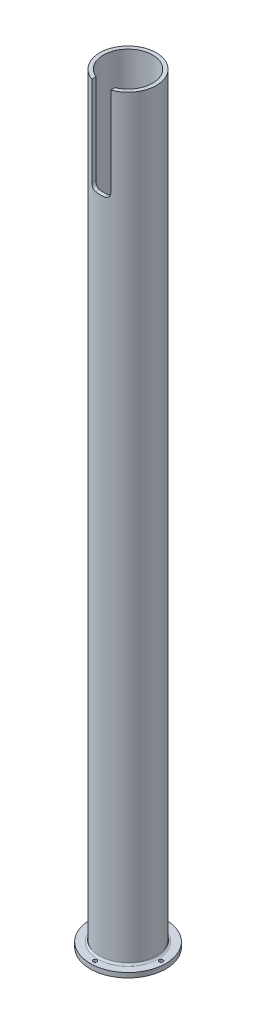
ISO-10303-21;
HEADER;
FILE_DESCRIPTION(('STEP AP214'),'2;1');
FILE_NAME('part.step','',(''),(''),'','','');
FILE_SCHEMA(('AUTOMOTIVE_DESIGN { 1 0 10303 214 1 1 1 1 }'));
ENDSEC;
DATA;
#1=APPLICATION_CONTEXT('core data for automotive mechanical design processes');
#2=APPLICATION_PROTOCOL_DEFINITION('international standard','automotive_design',2000,#1);
#3=PRODUCT_CONTEXT('',#1,'mechanical');
#4=PRODUCT('Part','Part','',(#3));
#5=PRODUCT_RELATED_PRODUCT_CATEGORY('part','',(#4));
#6=PRODUCT_DEFINITION_FORMATION('','',#4);
#7=PRODUCT_DEFINITION_CONTEXT('part definition',#1,'design');
#8=PRODUCT_DEFINITION('design','',#6,#7);
#9=PRODUCT_DEFINITION_SHAPE('','',#8);
#10=(LENGTH_UNIT() NAMED_UNIT(*) SI_UNIT(.MILLI.,.METRE.));
#11=(NAMED_UNIT(*) PLANE_ANGLE_UNIT() SI_UNIT($,.RADIAN.));
#12=(NAMED_UNIT(*) SI_UNIT($,.STERADIAN.) SOLID_ANGLE_UNIT());
#13=UNCERTAINTY_MEASURE_WITH_UNIT(LENGTH_MEASURE(1.E-05),#10,'distance_accuracy_value','');
#14=(GEOMETRIC_REPRESENTATION_CONTEXT(3) GLOBAL_UNCERTAINTY_ASSIGNED_CONTEXT((#13)) GLOBAL_UNIT_ASSIGNED_CONTEXT((#10,
#11,#12)) REPRESENTATION_CONTEXT('',''));
#15=CARTESIAN_POINT('',(0.,0.,0.));
#16=DIRECTION('',(0.,0.,1.));
#17=DIRECTION('',(1.,0.,0.));
#18=AXIS2_PLACEMENT_3D('',#15,#16,#17);
#19=CARTESIAN_POINT('',(0.,800.,0.));
#20=DIRECTION('',(0.,1.,0.));
#21=DIRECTION('',(0.,0.,1.));
#22=AXIS2_PLACEMENT_3D('',#19,#20,#21);
#23=PLANE('',#22);
#24=DIRECTION('',(0.,0.,-1.));
#25=VECTOR('',#24,1.);
#26=CARTESIAN_POINT('',(10.,800.,59.2422593859894));
#27=LINE('',#26,#25);
#28=CARTESIAN_POINT('',(10.,800.,28.2842712474619));
#29=VERTEX_POINT('',#28);
#30=CARTESIAN_POINT('',(10.,800.,24.));
#31=VERTEX_POINT('',#30);
#32=EDGE_CURVE('E93',#29,#31,#27,.T.);
#33=ORIENTED_EDGE('',*,*,#32,.F.);
#34=CARTESIAN_POINT('',(0.,800.,0.));
#35=DIRECTION('',(0.,1.,0.));
#36=DIRECTION('',(0.,0.,1.));
#37=AXIS2_PLACEMENT_3D('',#34,#35,#36);
#38=CIRCLE('',#37,30.);
#39=CARTESIAN_POINT('',(-10.,800.,28.2842712474619));
#40=VERTEX_POINT('',#39);
#41=EDGE_CURVE('E104',#29,#40,#38,.T.);
#42=ORIENTED_EDGE('',*,*,#41,.T.);
#43=DIRECTION('',(0.,0.,1.));
#44=VECTOR('',#43,1.);
#45=CARTESIAN_POINT('',(-10.,800.,59.2422593859894));
#46=LINE('',#45,#44);
#47=CARTESIAN_POINT('',(-10.,800.,24.));
#48=VERTEX_POINT('',#47);
#49=EDGE_CURVE('E107',#48,#40,#46,.T.);
#50=ORIENTED_EDGE('',*,*,#49,.F.);
#51=CARTESIAN_POINT('',(0.,800.,0.));
#52=DIRECTION('',(0.,1.,0.));
#53=DIRECTION('',(0.,0.,1.));
#54=AXIS2_PLACEMENT_3D('',#51,#52,#53);
#55=CIRCLE('',#54,26.);
#56=EDGE_CURVE('E106',#31,#48,#55,.T.);
#57=ORIENTED_EDGE('',*,*,#56,.F.);
#58=EDGE_LOOP('',(#33,#42,#50,#57));
#59=FACE_BOUND('',#58,.T.);
#60=ADVANCED_FACE('F36',(#59),#23,.T.);
#61=CARTESIAN_POINT('',(0.,800.,0.));
#62=DIRECTION('',(0.,-1.,0.));
#63=DIRECTION('',(0.,0.,-1.));
#64=AXIS2_PLACEMENT_3D('',#61,#62,#63);
#65=CYLINDRICAL_SURFACE('',#64,30.);
#66=ORIENTED_EDGE('',*,*,#41,.F.);
#67=DIRECTION('',(0.,-1.,0.));
#68=VECTOR('',#67,1.);
#69=CARTESIAN_POINT('',(10.,800.,28.2842712474619));
#70=LINE('',#69,#68);
#71=CARTESIAN_POINT('',(10.,705.,28.2842712474619));
#72=VERTEX_POINT('',#71);
#73=EDGE_CURVE('E90',#29,#72,#70,.T.);
#74=ORIENTED_EDGE('',*,*,#73,.T.);
#75=CARTESIAN_POINT('',(10.,705.,28.2842712474619));
#76=CARTESIAN_POINT('',(10.0000190729942,704.864337739915,28.2842568835754));
#77=CARTESIAN_POINT('',(9.99447954701745,704.728682456292,28.2862228024691));
#78=CARTESIAN_POINT('',(9.97242452302606,704.458407166221,28.294009981539));
#79=CARTESIAN_POINT('',(9.95591141628284,704.323786940685,28.2998304017733));
#80=CARTESIAN_POINT('',(9.91210971155053,704.056904848734,28.3152006115991));
#81=CARTESIAN_POINT('',(9.88485040485354,703.924637584562,28.3247402627795));
#82=CARTESIAN_POINT('',(9.8198196896855,703.663023642342,28.3473514268586));
#83=CARTESIAN_POINT('',(9.78204803970926,703.533677031466,28.3604230208981));
#84=CARTESIAN_POINT('',(9.69635010074509,703.27885238766,28.3898369422722));
#85=CARTESIAN_POINT('',(9.64842952739194,703.153372222611,28.4061774283579));
#86=CARTESIAN_POINT('',(9.54283633766438,702.907004468227,28.441824423037));
#87=CARTESIAN_POINT('',(9.48516009973037,702.786118604902,28.4611320328605));
#88=CARTESIAN_POINT('',(9.29815336408773,702.431505967402,28.5230014692243));
#89=CARTESIAN_POINT('',(9.15479335478684,702.205672157457,28.5695280039246));
#90=CARTESIAN_POINT('',(8.83013263364476,701.774275466147,28.6715626419015));
#91=CARTESIAN_POINT('',(8.64779954362491,701.56955093139,28.7273031988723));
#92=CARTESIAN_POINT('',(8.25291944408953,701.19304086922,28.8432248320726));
#93=CARTESIAN_POINT('',(8.04036219275768,701.02126655392,28.9034074101954));
#94=CARTESIAN_POINT('',(7.58000420509786,700.707600566116,29.0276228063441));
#95=CARTESIAN_POINT('',(7.33103250352341,700.567445619335,29.0917054388711));
#96=CARTESIAN_POINT('',(6.81247352936284,700.331380948338,29.2174811226627));
#97=CARTESIAN_POINT('',(6.54289755615135,700.235447173346,29.2791754560974));
#98=CARTESIAN_POINT('',(6.06074492852612,700.109175689502,29.3821685695545));
#99=CARTESIAN_POINT('',(5.85112670813669,700.068356546976,29.4246614762509));
#100=CARTESIAN_POINT('',(5.53366860939455,700.027416383081,29.4854225373401));
#101=CARTESIAN_POINT('',(5.42735465419152,700.01715109898,29.5051780558176));
#102=CARTESIAN_POINT('',(5.21406854364533,700.003441289199,29.543616278522));
#103=CARTESIAN_POINT('',(5.1070962346324,699.999998421625,29.5622987208798));
#104=CARTESIAN_POINT('',(5.00000000000003,700.,29.5803989154981));
#105=B_SPLINE_CURVE_WITH_KNOTS('',3,(#75,#76,#77,#78,#79,#80,#81,#82,#83,#84,#85,#86,#87,#88,
#89,#90,#91,#92,#93,#94,#95,#96,#97,#98,#99,#100,#101,#102,#103,#104),.UNSPECIFIED.,.F.,.F.,(4,
2,2,2,2,2,2,2,2,2,2,2,2,2,4),(0.,0.40684866099174,0.813608693968429,1.21926758890943,
1.62493580401968,2.0303761609891,2.43596735975757,3.24667110227931,4.08233899426423,
4.91829074009209,5.79267155602337,6.66657625564976,7.31802583416987,7.64368697008094,
7.96942724425668),.UNSPECIFIED.);
#106=CARTESIAN_POINT('',(5.,700.,29.5803989154981));
#107=VERTEX_POINT('',#106);
#108=EDGE_CURVE('E11',#72,#107,#105,.T.);
#109=ORIENTED_EDGE('',*,*,#108,.T.);
#110=CARTESIAN_POINT('',(0.,700.,0.));
#111=DIRECTION('',(0.,1.,0.));
#112=DIRECTION('',(0.,0.,1.));
#113=AXIS2_PLACEMENT_3D('',#110,#111,#112);
#114=CIRCLE('',#113,30.);
#115=CARTESIAN_POINT('',(-5.,700.,29.5803989154981));
#116=VERTEX_POINT('',#115);
#117=EDGE_CURVE('E198',#116,#107,#114,.T.);
#118=ORIENTED_EDGE('',*,*,#117,.F.);
#119=CARTESIAN_POINT('',(-5.,700.,29.5803989154981));
#120=CARTESIAN_POINT('',(-5.14356329835006,699.99998533013,29.5561430510399));
#121=CARTESIAN_POINT('',(-5.28693538648883,700.006182291599,29.5308233878388));
#122=CARTESIAN_POINT('',(-5.57225369279725,700.030796372334,29.4783116050369));
#123=CARTESIAN_POINT('',(-5.71420018171037,700.049211124933,29.4511198489871));
#124=CARTESIAN_POINT('',(-5.99548248658109,700.098023518038,29.3951487813498));
#125=CARTESIAN_POINT('',(-6.13482169036776,700.12840428602,29.3663717539848));
#126=CARTESIAN_POINT('',(-6.41014455563543,700.200859092261,29.3075050728138));
#127=CARTESIAN_POINT('',(-6.54612811649266,700.242933480707,29.2774153797204));
#128=CARTESIAN_POINT('',(-6.81376890309411,700.338409926113,29.2162864318836));
#129=CARTESIAN_POINT('',(-6.94542792437671,700.391807211379,29.1852475818345));
#130=CARTESIAN_POINT('',(-7.20366362728041,700.509564359083,29.1225838670055));
#131=CARTESIAN_POINT('',(-7.33023842228449,700.573928245326,29.0909587909403));
#132=CARTESIAN_POINT('',(-7.57741220064643,700.713152302678,29.0275576484614));
#133=CARTESIAN_POINT('',(-7.69801204220726,700.788010960439,28.9957816044545));
#134=CARTESIAN_POINT('',(-7.93250646196814,700.947773325003,28.9325093361093));
#135=CARTESIAN_POINT('',(-8.04639868798643,701.032680524518,28.9010132131808));
#136=CARTESIAN_POINT('',(-8.26821061678937,701.21324227422,28.83834533744));
#137=CARTESIAN_POINT('',(-8.37602472158754,701.309030334425,28.8071842542774));
#138=CARTESIAN_POINT('',(-8.58315951089427,701.509761214459,28.7461481442089));
#139=CARTESIAN_POINT('',(-8.68248035821225,701.614703858724,28.7162730926563));
#140=CARTESIAN_POINT('',(-8.87191921339151,701.833117334596,28.6583123592881));
#141=CARTESIAN_POINT('',(-8.96203415928858,701.946590982047,28.6302272739918));
#142=CARTESIAN_POINT('',(-9.13227100708294,702.181252354677,28.5763817895349));
#143=CARTESIAN_POINT('',(-9.21239698167155,702.302436905336,28.5506204441341));
#144=CARTESIAN_POINT('',(-9.36073810390687,702.549615837078,28.5023256215235));
#145=CARTESIAN_POINT('',(-9.42913305297223,702.675492967636,28.4797445943012));
#146=CARTESIAN_POINT('',(-9.55501632391858,702.933031200935,28.4377577440673));
#147=CARTESIAN_POINT('',(-9.61250940057613,703.064689751148,28.4183505373261));
#148=CARTESIAN_POINT('',(-9.71603523565319,703.332775725475,28.3831227026677));
#149=CARTESIAN_POINT('',(-9.76207783176459,703.46919894028,28.367298997034));
#150=CARTESIAN_POINT('',(-9.84229127682644,703.745824574741,28.3395675348903));
#151=CARTESIAN_POINT('',(-9.87646643616705,703.886025602272,28.3276583566629));
#152=CARTESIAN_POINT('',(-9.93621449172512,704.187415200438,28.3067632113827));
#153=CARTESIAN_POINT('',(-9.96011065220103,704.34897952921,28.2983519461048));
#154=CARTESIAN_POINT('',(-9.99201653741953,704.673695449396,28.287093365288));
#155=CARTESIAN_POINT('',(-10.000042056851,704.836845300165,28.2842405179736));
#156=CARTESIAN_POINT('',(-10.,705.,28.2842712474619));
#157=B_SPLINE_CURVE_WITH_KNOTS('',3,(#119,#120,#121,#122,#123,#124,#125,#126,#127,#128,#129,
#130,#131,#132,#133,#134,#135,#136,#137,#138,#139,#140,#141,#142,#143,#144,#145,#146,#147,#148,
#149,#150,#151,#152,#153,#154,#155,#156),.UNSPECIFIED.,.F.,.F.,(4,2,2,2,2,2,2,2,2,2,2,2,2,2,2,2,
2,2,4),(0.,0.436641760470257,0.873198965185514,1.30914279923487,1.74509968984119,
2.18087322340586,2.61680699426421,3.05267796785154,3.48870089064611,3.9308119350445,
4.37291450260232,4.81516364186799,5.25723187400142,5.69176213763664,6.12610244577488,
6.56006829073158,6.99387634900801,7.48360417374443,7.97284436857357),.UNSPECIFIED.);
#158=CARTESIAN_POINT('',(-10.,705.,28.2842712474619));
#159=VERTEX_POINT('',#158);
#160=EDGE_CURVE('E139',#116,#159,#157,.T.);
#161=ORIENTED_EDGE('',*,*,#160,.T.);
#162=DIRECTION('',(0.,-1.,0.));
#163=VECTOR('',#162,1.);
#164=CARTESIAN_POINT('',(-10.,800.,28.2842712474619));
#165=LINE('',#164,#163);
#166=EDGE_CURVE('E98',#159,#40,#165,.F.);
#167=ORIENTED_EDGE('',*,*,#166,.T.);
#168=EDGE_LOOP('',(#66,#74,#109,#118,#161,#167));
#169=FACE_BOUND('',#168,.T.);
#170=CARTESIAN_POINT('',(0.,2.,0.));
#171=DIRECTION('',(0.,-1.,0.));
#172=DIRECTION('',(0.,0.,-1.));
#173=AXIS2_PLACEMENT_3D('',#170,#171,#172);
#174=CIRCLE('',#173,30.);
#175=CARTESIAN_POINT('',(0.,2.,-30.));
#176=VERTEX_POINT('',#175);
#177=EDGE_CURVE('E116',#176,#176,#174,.F.);
#178=ORIENTED_EDGE('',*,*,#177,.T.);
#179=EDGE_LOOP('',(#178));
#180=FACE_BOUND('',#179,.T.);
#181=ADVANCED_FACE('F109',(#169,#180),#65,.T.);
#182=CARTESIAN_POINT('',(0.,800.,0.));
#183=DIRECTION('',(0.,-1.,0.));
#184=DIRECTION('',(0.,0.,-1.));
#185=AXIS2_PLACEMENT_3D('',#182,#183,#184);
#186=CYLINDRICAL_SURFACE('',#185,26.);
#187=DIRECTION('',(0.,-1.,0.));
#188=VECTOR('',#187,1.);
#189=CARTESIAN_POINT('',(10.,800.,24.));
#190=LINE('',#189,#188);
#191=CARTESIAN_POINT('',(10.,705.,24.));
#192=VERTEX_POINT('',#191);
#193=EDGE_CURVE('E128',#31,#192,#190,.T.);
#194=ORIENTED_EDGE('',*,*,#193,.F.);
#195=ORIENTED_EDGE('',*,*,#56,.T.);
#196=DIRECTION('',(0.,-1.,0.));
#197=VECTOR('',#196,1.);
#198=CARTESIAN_POINT('',(-10.,800.,24.));
#199=LINE('',#198,#197);
#200=CARTESIAN_POINT('',(-10.,705.,24.));
#201=VERTEX_POINT('',#200);
#202=EDGE_CURVE('E126',#201,#48,#199,.F.);
#203=ORIENTED_EDGE('',*,*,#202,.F.);
#204=CARTESIAN_POINT('',(-10.,705.,24.));
#205=CARTESIAN_POINT('',(-10.0000203739604,704.866027299063,23.9999826324827));
#206=CARTESIAN_POINT('',(-9.99461629302649,704.732063213962,24.0022429633645));
#207=CARTESIAN_POINT('',(-9.97311084717706,704.465181723348,24.0111913325979));
#208=CARTESIAN_POINT('',(-9.95701247686622,704.332264035364,24.0178781314523));
#209=CARTESIAN_POINT('',(-9.91434140994603,704.068869947469,24.0355223198063));
#210=CARTESIAN_POINT('',(-9.88780393045078,703.938386868615,24.0464653492114));
#211=CARTESIAN_POINT('',(-9.82453245039517,703.680327338934,24.0723853688244));
#212=CARTESIAN_POINT('',(-9.78779808149033,703.552750993287,24.0873625047566));
#213=CARTESIAN_POINT('',(-9.70451806058939,703.301468613663,24.121035222473));
#214=CARTESIAN_POINT('',(-9.65798095474682,703.17775931553,24.1397275644962));
#215=CARTESIAN_POINT('',(-9.55550083469302,702.934856816831,24.1804764657752));
#216=CARTESIAN_POINT('',(-9.4995543112067,702.815665321594,24.2025342799095));
#217=CARTESIAN_POINT('',(-9.31824510695372,702.465909779715,24.2731776885739));
#218=CARTESIAN_POINT('',(-9.17938049760873,702.243068084197,24.326246621884));
#219=CARTESIAN_POINT('',(-8.86359312797981,701.814651368173,24.4431202151248));
#220=CARTESIAN_POINT('',(-8.68534332824388,701.610158993728,24.5072758517159));
#221=CARTESIAN_POINT('',(-8.29918375140657,701.233278879585,24.6407234971345));
#222=CARTESIAN_POINT('',(-8.09126267960375,701.060903423428,24.7100174570748));
#223=CARTESIAN_POINT('',(-7.63692991869472,700.74226224617,24.8543261472597));
#224=CARTESIAN_POINT('',(-7.38892380770014,700.598305352467,24.9294275219288));
#225=CARTESIAN_POINT('',(-6.87144260467117,700.354635560737,25.0769915670757));
#226=CARTESIAN_POINT('',(-6.6019790152662,700.254899143455,25.1494556213766));
#227=CARTESIAN_POINT('',(-6.11064628377869,700.119832336048,25.2726941969938));
#228=CARTESIAN_POINT('',(-5.89164860710514,700.075076133735,25.3246894458936));
#229=CARTESIAN_POINT('',(-5.55944785287737,700.030138750191,25.3989262168892));
#230=CARTESIAN_POINT('',(-5.44808629220175,700.018859092418,25.4230478732498));
#231=CARTESIAN_POINT('',(-5.22454240649507,700.003788020424,25.4699280338164));
#232=CARTESIAN_POINT('',(-5.11235987384467,699.999998571093,25.4926861788176));
#233=CARTESIAN_POINT('',(-5.00000000000001,700.,25.5147016443461));
#234=B_SPLINE_CURVE_WITH_KNOTS('',3,(#204,#205,#206,#207,#208,#209,#210,#211,#212,#213,#214,
#215,#216,#217,#218,#219,#220,#221,#222,#223,#224,#225,#226,#227,#228,#229,#230,#231,#232,#233),
.UNSPECIFIED.,.F.,.F.,(4,2,2,2,2,2,2,2,2,2,2,2,2,2,4),(0.,0.40177665199195,0.803440846266159,
1.20376145985856,1.60409653620286,2.004084029138,2.40422103095302,3.20419050888792,
4.03696133507015,4.87005001459349,5.75527012868613,6.64001886008097,7.32643857431265,
7.66971273393976,8.01307693197778),.UNSPECIFIED.);
#235=CARTESIAN_POINT('',(-5.,700.,25.5147016443462));
#236=VERTEX_POINT('',#235);
#237=EDGE_CURVE('E144',#201,#236,#234,.T.);
#238=ORIENTED_EDGE('',*,*,#237,.T.);
#239=CARTESIAN_POINT('',(0.,700.,0.));
#240=DIRECTION('',(0.,1.,0.));
#241=DIRECTION('',(0.,0.,1.));
#242=AXIS2_PLACEMENT_3D('',#239,#240,#241);
#243=CIRCLE('',#242,26.);
#244=CARTESIAN_POINT('',(5.,700.,25.5147016443462));
#245=VERTEX_POINT('',#244);
#246=EDGE_CURVE('E124',#236,#245,#243,.T.);
#247=ORIENTED_EDGE('',*,*,#246,.T.);
#248=CARTESIAN_POINT('',(5.,700.,25.5147016443462));
#249=CARTESIAN_POINT('',(5.1445405352627,699.999985516817,25.4863894219269));
#250=CARTESIAN_POINT('',(5.28882133742468,700.006266679119,25.4568277378653));
#251=CARTESIAN_POINT('',(5.575805944671,700.03118245853,25.3955062705958));
#252=CARTESIAN_POINT('',(5.71851012783667,700.049814045569,25.3637470282511));
#253=CARTESIAN_POINT('',(6.00112097343041,700.099152054792,25.2983714306583));
#254=CARTESIAN_POINT('',(6.14103188865585,700.129838370187,25.2647582475481));
#255=CARTESIAN_POINT('',(6.41736145407565,700.20296847441,25.1959864620634));
#256=CARTESIAN_POINT('',(6.55377994769365,700.245412789381,25.1608277905911));
#257=CARTESIAN_POINT('',(6.82213632498404,700.341660496423,25.0893947349606));
#258=CARTESIAN_POINT('',(6.95407711767392,700.39545634318,25.0531211055255));
#259=CARTESIAN_POINT('',(7.2127782450814,700.514036718895,24.9798701016167));
#260=CARTESIAN_POINT('',(7.33953677925044,700.578825027531,24.9428924889792));
#261=CARTESIAN_POINT('',(7.58705091294714,700.718949180378,24.8687224218128));
#262=CARTESIAN_POINT('',(7.70780537173284,700.794287018645,24.8315299279445));
#263=CARTESIAN_POINT('',(7.94251984956043,700.955026652714,24.7574539340845));
#264=CARTESIAN_POINT('',(8.05647986235346,701.040428457772,24.720570434377));
#265=CARTESIAN_POINT('',(8.27905965313581,701.222585885615,24.6469305569304));
#266=CARTESIAN_POINT('',(8.38752797380225,701.319533675589,24.610191324416));
#267=CARTESIAN_POINT('',(8.59581562058985,701.522749352798,24.5382169952368));
#268=CARTESIAN_POINT('',(8.69563814544229,701.629013763581,24.5029813447526));
#269=CARTESIAN_POINT('',(8.88597056801268,701.850310709897,24.4346017099003));
#270=CARTESIAN_POINT('',(8.97647563838966,701.965347737302,24.4014588131846));
#271=CARTESIAN_POINT('',(9.14732704961123,702.203371966536,24.3379274788782));
#272=CARTESIAN_POINT('',(9.22767804020405,702.326355490232,24.3075377823623));
#273=CARTESIAN_POINT('',(9.37583463151774,702.576627644054,24.2507706666763));
#274=CARTESIAN_POINT('',(9.44388402433344,702.703754713495,24.2243177053024));
#275=CARTESIAN_POINT('',(9.56895467863086,702.96395507,24.1751860572104));
#276=CARTESIAN_POINT('',(9.62598107387812,703.097025553302,24.1525056141987));
#277=CARTESIAN_POINT('',(9.7283928664867,703.368050371448,24.111437545915));
#278=CARTESIAN_POINT('',(9.77379100877415,703.50599916907,24.0930452227333));
#279=CARTESIAN_POINT('',(9.85250219536505,703.785776478062,24.060964112752));
#280=CARTESIAN_POINT('',(9.88582025553398,703.927603352817,24.0472733738957));
#281=CARTESIAN_POINT('',(9.94180271263749,704.223635371913,24.0241877986128));
#282=CARTESIAN_POINT('',(9.96360234092142,704.378032581035,24.0151428165003));
#283=CARTESIAN_POINT('',(9.99271394727299,704.688283420518,24.0030354138136));
#284=CARTESIAN_POINT('',(10.0000382217713,704.844135701646,23.9999679155559));
#285=CARTESIAN_POINT('',(10.,705.,24.));
#286=B_SPLINE_CURVE_WITH_KNOTS('',3,(#248,#249,#250,#251,#252,#253,#254,#255,#256,#257,#258,
#259,#260,#261,#262,#263,#264,#265,#266,#267,#268,#269,#270,#271,#272,#273,#274,#275,#276,#277,
#278,#279,#280,#281,#282,#283,#284,#285),.UNSPECIFIED.,.F.,.F.,(4,2,2,2,2,2,2,2,2,2,2,2,2,2,2,2,
2,2,4),(0.,0.441701273764072,0.883294220014509,1.32415371364413,1.76503293791645,
2.20562002963241,2.64635892215706,3.08718123519919,3.52800395366035,3.97760160375254,
4.42703219684701,4.87669447880155,5.3261500998217,5.76538206486655,6.20440896991304,
6.64295260870606,7.08131394726205,7.54908632551721,8.01646117240755),.UNSPECIFIED.);
#287=EDGE_CURVE('E49',#245,#192,#286,.T.);
#288=ORIENTED_EDGE('',*,*,#287,.T.);
#289=EDGE_LOOP('',(#194,#195,#203,#238,#247,#288));
#290=FACE_BOUND('',#289,.T.);
#291=CARTESIAN_POINT('',(0.,-5.,0.));
#292=DIRECTION('',(0.,-1.,0.));
#293=DIRECTION('',(0.,0.,-1.));
#294=AXIS2_PLACEMENT_3D('',#291,#292,#293);
#295=CIRCLE('',#294,26.);
#296=CARTESIAN_POINT('',(0.,-5.,-26.));
#297=VERTEX_POINT('',#296);
#298=EDGE_CURVE('E225',#297,#297,#295,.T.);
#299=ORIENTED_EDGE('',*,*,#298,.T.);
#300=EDGE_LOOP('',(#299));
#301=FACE_BOUND('',#300,.T.);
#302=ADVANCED_FACE('F177',(#290,#301),#186,.F.);
#303=CARTESIAN_POINT('',(0.,0.,0.));
#304=DIRECTION('',(0.,-1.,0.));
#305=DIRECTION('',(0.,0.,-1.));
#306=AXIS2_PLACEMENT_3D('',#303,#304,#305);
#307=PLANE('',#306);
#308=CARTESIAN_POINT('',(0.,0.,0.));
#309=DIRECTION('',(0.,-1.,0.));
#310=DIRECTION('',(0.,0.,-1.));
#311=AXIS2_PLACEMENT_3D('',#308,#309,#310);
#312=CIRCLE('',#311,32.);
#313=CARTESIAN_POINT('',(0.,0.,-32.));
#314=VERTEX_POINT('',#313);
#315=EDGE_CURVE('E113',#314,#314,#312,.T.);
#316=ORIENTED_EDGE('',*,*,#315,.T.);
#317=EDGE_LOOP('',(#316));
#318=FACE_BOUND('',#317,.T.);
#319=CARTESIAN_POINT('',(0.,0.,-35.));
#320=DIRECTION('',(0.,-1.,0.));
#321=DIRECTION('',(0.,0.,-1.));
#322=AXIS2_PLACEMENT_3D('',#319,#320,#321);
#323=CIRCLE('',#322,2.);
#324=CARTESIAN_POINT('',(0.,0.,-37.));
#325=VERTEX_POINT('',#324);
#326=EDGE_CURVE('E97',#325,#325,#323,.T.);
#327=ORIENTED_EDGE('',*,*,#326,.T.);
#328=EDGE_LOOP('',(#327));
#329=FACE_BOUND('',#328,.T.);
#330=CARTESIAN_POINT('',(35.,0.,0.));
#331=DIRECTION('',(0.,-1.,0.));
#332=DIRECTION('',(0.,0.,-1.));
#333=AXIS2_PLACEMENT_3D('',#330,#331,#332);
#334=CIRCLE('',#333,2.);
#335=CARTESIAN_POINT('',(35.,0.,-2.));
#336=VERTEX_POINT('',#335);
#337=EDGE_CURVE('E213',#336,#336,#334,.T.);
#338=ORIENTED_EDGE('',*,*,#337,.T.);
#339=EDGE_LOOP('',(#338));
#340=FACE_BOUND('',#339,.T.);
#341=CARTESIAN_POINT('',(0.,0.,0.));
#342=DIRECTION('',(0.,-1.,0.));
#343=DIRECTION('',(0.,0.,-1.));
#344=AXIS2_PLACEMENT_3D('',#341,#342,#343);
#345=CIRCLE('',#344,40.);
#346=CARTESIAN_POINT('',(0.,0.,-40.));
#347=VERTEX_POINT('',#346);
#348=EDGE_CURVE('E230',#347,#347,#345,.T.);
#349=ORIENTED_EDGE('',*,*,#348,.F.);
#350=EDGE_LOOP('',(#349));
#351=FACE_BOUND('',#350,.T.);
#352=CARTESIAN_POINT('',(0.,0.,35.));
#353=DIRECTION('',(0.,-1.,0.));
#354=DIRECTION('',(0.,0.,-1.));
#355=AXIS2_PLACEMENT_3D('',#352,#353,#354);
#356=CIRCLE('',#355,2.);
#357=CARTESIAN_POINT('',(0.,0.,33.));
#358=VERTEX_POINT('',#357);
#359=EDGE_CURVE('E219',#358,#358,#356,.T.);
#360=ORIENTED_EDGE('',*,*,#359,.T.);
#361=EDGE_LOOP('',(#360));
#362=FACE_BOUND('',#361,.T.);
#363=CARTESIAN_POINT('',(-35.,0.,0.));
#364=DIRECTION('',(0.,-1.,0.));
#365=DIRECTION('',(0.,0.,-1.));
#366=AXIS2_PLACEMENT_3D('',#363,#364,#365);
#367=CIRCLE('',#366,2.);
#368=CARTESIAN_POINT('',(-35.,0.,-2.));
#369=VERTEX_POINT('',#368);
#370=EDGE_CURVE('E207',#369,#369,#367,.T.);
#371=ORIENTED_EDGE('',*,*,#370,.T.);
#372=EDGE_LOOP('',(#371));
#373=FACE_BOUND('',#372,.T.);
#374=ADVANCED_FACE('F181',(#318,#329,#340,#351,#362,#373),#307,.F.);
#375=CARTESIAN_POINT('',(0.,-5.,0.));
#376=DIRECTION('',(0.,-1.,0.));
#377=DIRECTION('',(0.,0.,-1.));
#378=AXIS2_PLACEMENT_3D('',#375,#376,#377);
#379=PLANE('',#378);
#380=CARTESIAN_POINT('',(-35.,-5.,0.));
#381=DIRECTION('',(0.,-1.,0.));
#382=DIRECTION('',(0.,0.,-1.));
#383=AXIS2_PLACEMENT_3D('',#380,#381,#382);
#384=CIRCLE('',#383,2.);
#385=CARTESIAN_POINT('',(-35.,-5.,-2.));
#386=VERTEX_POINT('',#385);
#387=EDGE_CURVE('E210',#386,#386,#384,.T.);
#388=ORIENTED_EDGE('',*,*,#387,.F.);
#389=EDGE_LOOP('',(#388));
#390=FACE_BOUND('',#389,.T.);
#391=CARTESIAN_POINT('',(0.,-5.,35.));
#392=DIRECTION('',(0.,-1.,0.));
#393=DIRECTION('',(0.,0.,-1.));
#394=AXIS2_PLACEMENT_3D('',#391,#392,#393);
#395=CIRCLE('',#394,2.);
#396=CARTESIAN_POINT('',(0.,-5.,33.));
#397=VERTEX_POINT('',#396);
#398=EDGE_CURVE('E222',#397,#397,#395,.T.);
#399=ORIENTED_EDGE('',*,*,#398,.F.);
#400=EDGE_LOOP('',(#399));
#401=FACE_BOUND('',#400,.T.);
#402=CARTESIAN_POINT('',(0.,-5.,0.));
#403=DIRECTION('',(0.,-1.,0.));
#404=DIRECTION('',(0.,0.,-1.));
#405=AXIS2_PLACEMENT_3D('',#402,#403,#404);
#406=CIRCLE('',#405,40.);
#407=CARTESIAN_POINT('',(0.,-5.,-40.));
#408=VERTEX_POINT('',#407);
#409=EDGE_CURVE('E118',#408,#408,#406,.T.);
#410=ORIENTED_EDGE('',*,*,#409,.T.);
#411=EDGE_LOOP('',(#410));
#412=FACE_BOUND('',#411,.T.);
#413=ORIENTED_EDGE('',*,*,#298,.F.);
#414=EDGE_LOOP('',(#413));
#415=FACE_BOUND('',#414,.T.);
#416=CARTESIAN_POINT('',(35.,-5.,0.));
#417=DIRECTION('',(0.,-1.,0.));
#418=DIRECTION('',(0.,0.,-1.));
#419=AXIS2_PLACEMENT_3D('',#416,#417,#418);
#420=CIRCLE('',#419,2.);
#421=CARTESIAN_POINT('',(35.,-5.,-2.));
#422=VERTEX_POINT('',#421);
#423=EDGE_CURVE('E216',#422,#422,#420,.T.);
#424=ORIENTED_EDGE('',*,*,#423,.F.);
#425=EDGE_LOOP('',(#424));
#426=FACE_BOUND('',#425,.T.);
#427=CARTESIAN_POINT('',(0.,-5.,-35.));
#428=DIRECTION('',(0.,-1.,0.));
#429=DIRECTION('',(0.,0.,-1.));
#430=AXIS2_PLACEMENT_3D('',#427,#428,#429);
#431=CIRCLE('',#430,2.);
#432=CARTESIAN_POINT('',(0.,-5.,-37.));
#433=VERTEX_POINT('',#432);
#434=EDGE_CURVE('E204',#433,#433,#431,.T.);
#435=ORIENTED_EDGE('',*,*,#434,.F.);
#436=EDGE_LOOP('',(#435));
#437=FACE_BOUND('',#436,.T.);
#438=ADVANCED_FACE('F238',(#390,#401,#412,#415,#426,#437),#379,.T.);
#439=CARTESIAN_POINT('',(0.,-5.,0.));
#440=DIRECTION('',(0.,1.,0.));
#441=DIRECTION('',(0.,0.,1.));
#442=AXIS2_PLACEMENT_3D('',#439,#440,#441);
#443=CYLINDRICAL_SURFACE('',#442,40.);
#444=ORIENTED_EDGE('',*,*,#409,.F.);
#445=EDGE_LOOP('',(#444));
#446=FACE_BOUND('',#445,.T.);
#447=ORIENTED_EDGE('',*,*,#348,.T.);
#448=EDGE_LOOP('',(#447));
#449=FACE_BOUND('',#448,.T.);
#450=ADVANCED_FACE('F182',(#446,#449),#443,.T.);
#451=CARTESIAN_POINT('',(0.,-5.,35.));
#452=DIRECTION('',(0.,1.,0.));
#453=DIRECTION('',(0.,0.,1.));
#454=AXIS2_PLACEMENT_3D('',#451,#452,#453);
#455=CYLINDRICAL_SURFACE('',#454,2.);
#456=ORIENTED_EDGE('',*,*,#398,.T.);
#457=EDGE_LOOP('',(#456));
#458=FACE_BOUND('',#457,.T.);
#459=ORIENTED_EDGE('',*,*,#359,.F.);
#460=EDGE_LOOP('',(#459));
#461=FACE_BOUND('',#460,.T.);
#462=ADVANCED_FACE('F251',(#458,#461),#455,.F.);
#463=CARTESIAN_POINT('',(35.,-5.,0.));
#464=DIRECTION('',(0.,1.,0.));
#465=DIRECTION('',(0.,0.,1.));
#466=AXIS2_PLACEMENT_3D('',#463,#464,#465);
#467=CYLINDRICAL_SURFACE('',#466,2.);
#468=ORIENTED_EDGE('',*,*,#423,.T.);
#469=EDGE_LOOP('',(#468));
#470=FACE_BOUND('',#469,.T.);
#471=ORIENTED_EDGE('',*,*,#337,.F.);
#472=EDGE_LOOP('',(#471));
#473=FACE_BOUND('',#472,.T.);
#474=ADVANCED_FACE('F245',(#470,#473),#467,.F.);
#475=CARTESIAN_POINT('',(-35.,-5.,0.));
#476=DIRECTION('',(0.,1.,0.));
#477=DIRECTION('',(0.,0.,1.));
#478=AXIS2_PLACEMENT_3D('',#475,#476,#477);
#479=CYLINDRICAL_SURFACE('',#478,2.);
#480=ORIENTED_EDGE('',*,*,#387,.T.);
#481=EDGE_LOOP('',(#480));
#482=FACE_BOUND('',#481,.T.);
#483=ORIENTED_EDGE('',*,*,#370,.F.);
#484=EDGE_LOOP('',(#483));
#485=FACE_BOUND('',#484,.T.);
#486=ADVANCED_FACE('F168',(#482,#485),#479,.F.);
#487=CARTESIAN_POINT('',(0.,-5.,-35.));
#488=DIRECTION('',(0.,1.,0.));
#489=DIRECTION('',(0.,0.,1.));
#490=AXIS2_PLACEMENT_3D('',#487,#488,#489);
#491=CYLINDRICAL_SURFACE('',#490,2.);
#492=ORIENTED_EDGE('',*,*,#434,.T.);
#493=EDGE_LOOP('',(#492));
#494=FACE_BOUND('',#493,.T.);
#495=ORIENTED_EDGE('',*,*,#326,.F.);
#496=EDGE_LOOP('',(#495));
#497=FACE_BOUND('',#496,.T.);
#498=ADVANCED_FACE('F160',(#494,#497),#491,.F.);
#499=CARTESIAN_POINT('',(0.,2.,0.));
#500=DIRECTION('',(0.,-1.,0.));
#501=DIRECTION('',(0.,0.,-1.));
#502=AXIS2_PLACEMENT_3D('',#499,#500,#501);
#503=TOROIDAL_SURFACE('',#502,32.,2.);
#504=ORIENTED_EDGE('',*,*,#177,.F.);
#505=EDGE_LOOP('',(#504));
#506=FACE_BOUND('',#505,.T.);
#507=ORIENTED_EDGE('',*,*,#315,.F.);
#508=EDGE_LOOP('',(#507));
#509=FACE_BOUND('',#508,.T.);
#510=ADVANCED_FACE('F157',(#506,#509),#503,.F.);
#511=CARTESIAN_POINT('',(10.,700.,59.2422593859894));
#512=DIRECTION('',(1.,0.,0.));
#513=DIRECTION('',(0.,0.,-1.));
#514=AXIS2_PLACEMENT_3D('',#511,#512,#513);
#515=PLANE('',#514);
#516=ORIENTED_EDGE('',*,*,#193,.T.);
#517=DIRECTION('',(0.,0.,-1.));
#518=VECTOR('',#517,1.);
#519=CARTESIAN_POINT('',(10.,705.,59.2422593859894));
#520=LINE('',#519,#518);
#521=EDGE_CURVE('E56',#192,#72,#520,.F.);
#522=ORIENTED_EDGE('',*,*,#521,.T.);
#523=ORIENTED_EDGE('',*,*,#73,.F.);
#524=ORIENTED_EDGE('',*,*,#32,.T.);
#525=EDGE_LOOP('',(#516,#522,#523,#524));
#526=FACE_BOUND('',#525,.T.);
#527=ADVANCED_FACE('F92',(#526),#515,.F.);
#528=CARTESIAN_POINT('',(-10.,700.,59.2422593859894));
#529=DIRECTION('',(-1.,0.,0.));
#530=DIRECTION('',(0.,0.,1.));
#531=AXIS2_PLACEMENT_3D('',#528,#529,#530);
#532=PLANE('',#531);
#533=ORIENTED_EDGE('',*,*,#166,.F.);
#534=DIRECTION('',(0.,0.,1.));
#535=VECTOR('',#534,1.);
#536=CARTESIAN_POINT('',(-10.,705.,59.2422593859894));
#537=LINE('',#536,#535);
#538=EDGE_CURVE('E136',#159,#201,#537,.F.);
#539=ORIENTED_EDGE('',*,*,#538,.T.);
#540=ORIENTED_EDGE('',*,*,#202,.T.);
#541=ORIENTED_EDGE('',*,*,#49,.T.);
#542=EDGE_LOOP('',(#533,#539,#540,#541));
#543=FACE_BOUND('',#542,.T.);
#544=ADVANCED_FACE('F166',(#543),#532,.F.);
#545=CARTESIAN_POINT('',(10.,700.,6.15009037109005));
#546=DIRECTION('',(0.,1.,0.));
#547=DIRECTION('',(0.,0.,1.));
#548=AXIS2_PLACEMENT_3D('',#545,#546,#547);
#549=PLANE('',#548);
#550=ORIENTED_EDGE('',*,*,#246,.F.);
#551=DIRECTION('',(0.,0.,1.));
#552=VECTOR('',#551,1.);
#553=CARTESIAN_POINT('',(-5.,700.,6.15009037109005));
#554=LINE('',#553,#552);
#555=EDGE_CURVE('E133',#236,#116,#554,.T.);
#556=ORIENTED_EDGE('',*,*,#555,.T.);
#557=ORIENTED_EDGE('',*,*,#117,.T.);
#558=DIRECTION('',(0.,0.,-1.));
#559=VECTOR('',#558,1.);
#560=CARTESIAN_POINT('',(5.,700.,6.15009037109005));
#561=LINE('',#560,#559);
#562=EDGE_CURVE('E130',#107,#245,#561,.T.);
#563=ORIENTED_EDGE('',*,*,#562,.T.);
#564=EDGE_LOOP('',(#550,#556,#557,#563));
#565=FACE_BOUND('',#564,.T.);
#566=ADVANCED_FACE('F155',(#565),#549,.T.);
#567=CARTESIAN_POINT('',(-5.,705.,6.15009037109005));
#568=DIRECTION('',(0.,0.,1.));
#569=DIRECTION('',(1.,0.,0.));
#570=AXIS2_PLACEMENT_3D('',#567,#568,#569);
#571=CYLINDRICAL_SURFACE('',#570,5.);
#572=ORIENTED_EDGE('',*,*,#237,.F.);
#573=ORIENTED_EDGE('',*,*,#538,.F.);
#574=ORIENTED_EDGE('',*,*,#160,.F.);
#575=ORIENTED_EDGE('',*,*,#555,.F.);
#576=EDGE_LOOP('',(#572,#573,#574,#575));
#577=FACE_BOUND('',#576,.T.);
#578=ADVANCED_FACE('F152',(#577),#571,.F.);
#579=CARTESIAN_POINT('',(5.,705.,6.15009037109005));
#580=DIRECTION('',(0.,0.,-1.));
#581=DIRECTION('',(-1.,0.,0.));
#582=AXIS2_PLACEMENT_3D('',#579,#580,#581);
#583=CYLINDRICAL_SURFACE('',#582,5.);
#584=ORIENTED_EDGE('',*,*,#108,.F.);
#585=ORIENTED_EDGE('',*,*,#521,.F.);
#586=ORIENTED_EDGE('',*,*,#287,.F.);
#587=ORIENTED_EDGE('',*,*,#562,.F.);
#588=EDGE_LOOP('',(#584,#585,#586,#587));
#589=FACE_BOUND('',#588,.T.);
#590=ADVANCED_FACE('F38',(#589),#583,.F.);
#591=CLOSED_SHELL('',(#60,#181,#302,#374,#438,#450,#462,#474,#486,#498,#510,#527,#544,#566,#578,#590));
#592=MANIFOLD_SOLID_BREP('B2',#591);
#593=ADVANCED_BREP_SHAPE_REPRESENTATION('',(#18,#592),#14);
#594=SHAPE_DEFINITION_REPRESENTATION(#9,#593);
ENDSEC;
END-ISO-10303-21;
